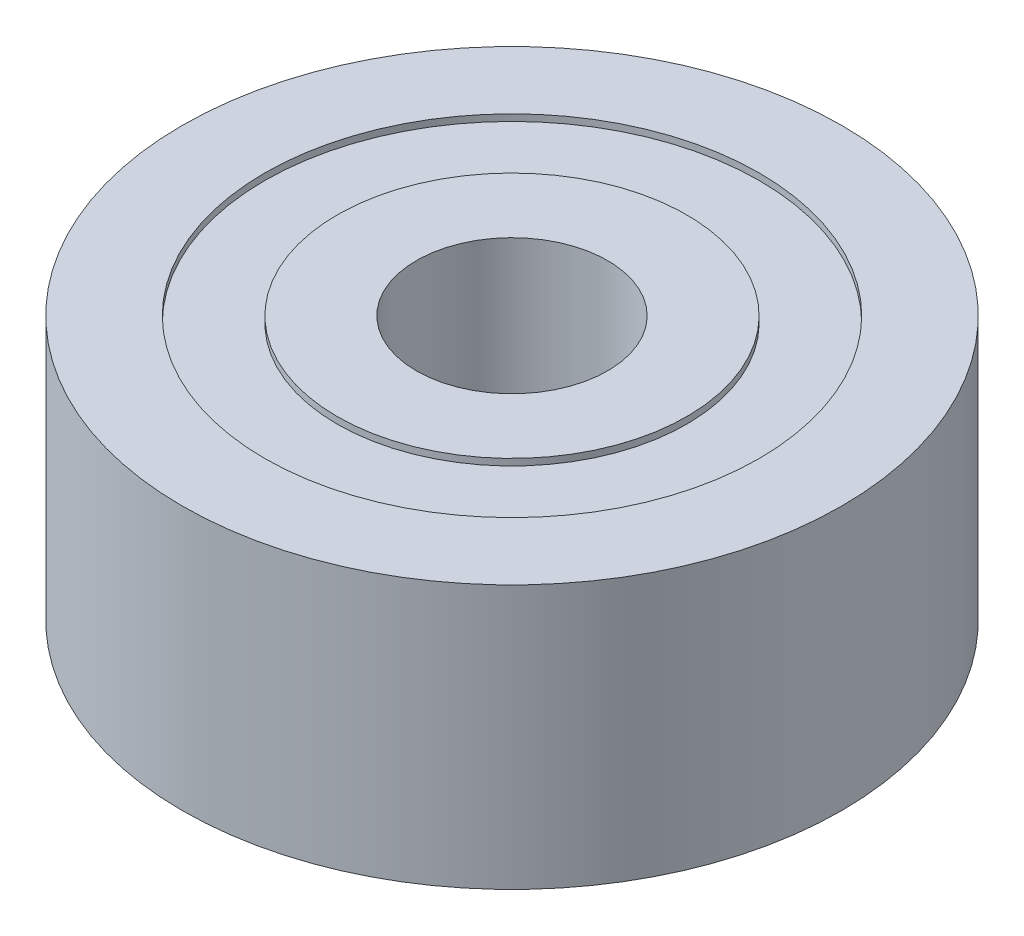
ISO-10303-21;
HEADER;
FILE_DESCRIPTION(('STEP AP214'),'2;1');
FILE_NAME('part.step','',(''),(''),'','','');
FILE_SCHEMA(('AUTOMOTIVE_DESIGN { 1 0 10303 214 1 1 1 1 }'));
ENDSEC;
DATA;
#1=APPLICATION_CONTEXT('core data for automotive mechanical design processes');
#2=APPLICATION_PROTOCOL_DEFINITION('international standard','automotive_design',2000,#1);
#3=PRODUCT_CONTEXT('',#1,'mechanical');
#4=PRODUCT('Part','Part','',(#3));
#5=PRODUCT_RELATED_PRODUCT_CATEGORY('part','',(#4));
#6=PRODUCT_DEFINITION_FORMATION('','',#4);
#7=PRODUCT_DEFINITION_CONTEXT('part definition',#1,'design');
#8=PRODUCT_DEFINITION('design','',#6,#7);
#9=PRODUCT_DEFINITION_SHAPE('','',#8);
#10=(LENGTH_UNIT() NAMED_UNIT(*) SI_UNIT(.MILLI.,.METRE.));
#11=(NAMED_UNIT(*) PLANE_ANGLE_UNIT() SI_UNIT($,.RADIAN.));
#12=(NAMED_UNIT(*) SI_UNIT($,.STERADIAN.) SOLID_ANGLE_UNIT());
#13=UNCERTAINTY_MEASURE_WITH_UNIT(LENGTH_MEASURE(1.E-05),#10,'distance_accuracy_value','');
#14=(GEOMETRIC_REPRESENTATION_CONTEXT(3) GLOBAL_UNCERTAINTY_ASSIGNED_CONTEXT((#13)) GLOBAL_UNIT_ASSIGNED_CONTEXT((#10,
#11,#12)) REPRESENTATION_CONTEXT('',''));
#15=CARTESIAN_POINT('',(0.,0.,0.));
#16=DIRECTION('',(0.,0.,1.));
#17=DIRECTION('',(1.,0.,0.));
#18=AXIS2_PLACEMENT_3D('',#15,#16,#17);
#19=CARTESIAN_POINT('',(0.,-2.,0.));
#20=DIRECTION('',(0.,1.,0.));
#21=DIRECTION('',(0.,0.,1.));
#22=AXIS2_PLACEMENT_3D('',#19,#20,#21);
#23=PLANE('',#22);
#24=CARTESIAN_POINT('',(0.,-2.,0.));
#25=DIRECTION('',(0.,1.,0.));
#26=DIRECTION('',(0.,0.,1.));
#27=AXIS2_PLACEMENT_3D('',#24,#25,#26);
#28=CIRCLE('',#27,1.45);
#29=CARTESIAN_POINT('',(0.,-2.,1.45));
#30=VERTEX_POINT('',#29);
#31=EDGE_CURVE('E52',#30,#30,#28,.T.);
#32=ORIENTED_EDGE('',*,*,#31,.T.);
#33=EDGE_LOOP('',(#32));
#34=FACE_BOUND('',#33,.T.);
#35=CARTESIAN_POINT('',(0.,-2.,0.));
#36=DIRECTION('',(0.,1.,0.));
#37=DIRECTION('',(0.,0.,1.));
#38=AXIS2_PLACEMENT_3D('',#35,#36,#37);
#39=CIRCLE('',#38,2.65);
#40=CARTESIAN_POINT('',(0.,-2.,2.65));
#41=VERTEX_POINT('',#40);
#42=EDGE_CURVE('E84',#41,#41,#39,.T.);
#43=ORIENTED_EDGE('',*,*,#42,.F.);
#44=EDGE_LOOP('',(#43));
#45=FACE_BOUND('',#44,.T.);
#46=ADVANCED_FACE('F37',(#34,#45),#23,.F.);
#47=CARTESIAN_POINT('',(0.,2.,0.));
#48=DIRECTION('',(0.,1.,0.));
#49=DIRECTION('',(0.,0.,1.));
#50=AXIS2_PLACEMENT_3D('',#47,#48,#49);
#51=PLANE('',#50);
#52=CARTESIAN_POINT('',(0.,2.,0.));
#53=DIRECTION('',(0.,1.,0.));
#54=DIRECTION('',(0.,0.,1.));
#55=AXIS2_PLACEMENT_3D('',#52,#53,#54);
#56=CIRCLE('',#55,1.45);
#57=CARTESIAN_POINT('',(0.,2.,1.45));
#58=VERTEX_POINT('',#57);
#59=EDGE_CURVE('E50',#58,#58,#56,.T.);
#60=ORIENTED_EDGE('',*,*,#59,.F.);
#61=EDGE_LOOP('',(#60));
#62=FACE_BOUND('',#61,.T.);
#63=CARTESIAN_POINT('',(0.,2.,0.));
#64=DIRECTION('',(0.,1.,0.));
#65=DIRECTION('',(0.,0.,1.));
#66=AXIS2_PLACEMENT_3D('',#63,#64,#65);
#67=CIRCLE('',#66,2.65);
#68=CARTESIAN_POINT('',(0.,2.,2.65));
#69=VERTEX_POINT('',#68);
#70=EDGE_CURVE('E68',#69,#69,#67,.T.);
#71=ORIENTED_EDGE('',*,*,#70,.T.);
#72=EDGE_LOOP('',(#71));
#73=FACE_BOUND('',#72,.T.);
#74=ADVANCED_FACE('F102',(#62,#73),#51,.T.);
#75=CARTESIAN_POINT('',(0.,2.,0.));
#76=DIRECTION('',(0.,1.,0.));
#77=DIRECTION('',(0.,0.,1.));
#78=AXIS2_PLACEMENT_3D('',#75,#76,#77);
#79=CIRCLE('',#78,3.75);
#80=CARTESIAN_POINT('',(0.,2.,3.75));
#81=VERTEX_POINT('',#80);
#82=EDGE_CURVE('E60',#81,#81,#79,.T.);
#83=ORIENTED_EDGE('',*,*,#82,.F.);
#84=EDGE_LOOP('',(#83));
#85=FACE_BOUND('',#84,.T.);
#86=CARTESIAN_POINT('',(0.,2.,0.));
#87=DIRECTION('',(0.,1.,0.));
#88=DIRECTION('',(0.,0.,1.));
#89=AXIS2_PLACEMENT_3D('',#86,#87,#88);
#90=CIRCLE('',#89,5.);
#91=CARTESIAN_POINT('',(0.,2.,5.));
#92=VERTEX_POINT('',#91);
#93=EDGE_CURVE('E10',#92,#92,#90,.T.);
#94=ORIENTED_EDGE('',*,*,#93,.T.);
#95=EDGE_LOOP('',(#94));
#96=FACE_BOUND('',#95,.T.);
#97=ADVANCED_FACE('F108',(#85,#96),#51,.T.);
#98=CARTESIAN_POINT('',(0.,-2.,0.));
#99=DIRECTION('',(0.,1.,0.));
#100=DIRECTION('',(0.,0.,1.));
#101=AXIS2_PLACEMENT_3D('',#98,#99,#100);
#102=CIRCLE('',#101,3.75);
#103=CARTESIAN_POINT('',(0.,-2.,3.75));
#104=VERTEX_POINT('',#103);
#105=EDGE_CURVE('E76',#104,#104,#102,.T.);
#106=ORIENTED_EDGE('',*,*,#105,.T.);
#107=EDGE_LOOP('',(#106));
#108=FACE_BOUND('',#107,.T.);
#109=CARTESIAN_POINT('',(0.,-2.,0.));
#110=DIRECTION('',(0.,1.,0.));
#111=DIRECTION('',(0.,0.,1.));
#112=AXIS2_PLACEMENT_3D('',#109,#110,#111);
#113=CIRCLE('',#112,5.);
#114=CARTESIAN_POINT('',(0.,-2.,5.));
#115=VERTEX_POINT('',#114);
#116=EDGE_CURVE('E41',#115,#115,#113,.T.);
#117=ORIENTED_EDGE('',*,*,#116,.F.);
#118=EDGE_LOOP('',(#117));
#119=FACE_BOUND('',#118,.T.);
#120=ADVANCED_FACE('F104',(#108,#119),#23,.F.);
#121=CARTESIAN_POINT('',(0.,2.,0.));
#122=DIRECTION('',(0.,-1.,0.));
#123=DIRECTION('',(0.,0.,-1.));
#124=AXIS2_PLACEMENT_3D('',#121,#122,#123);
#125=CYLINDRICAL_SURFACE('',#124,5.);
#126=ORIENTED_EDGE('',*,*,#93,.F.);
#127=EDGE_LOOP('',(#126));
#128=FACE_BOUND('',#127,.T.);
#129=ORIENTED_EDGE('',*,*,#116,.T.);
#130=EDGE_LOOP('',(#129));
#131=FACE_BOUND('',#130,.T.);
#132=ADVANCED_FACE('F39',(#128,#131),#125,.T.);
#133=CARTESIAN_POINT('',(0.,2.,0.));
#134=DIRECTION('',(0.,-1.,0.));
#135=DIRECTION('',(0.,0.,-1.));
#136=AXIS2_PLACEMENT_3D('',#133,#134,#135);
#137=CYLINDRICAL_SURFACE('',#136,1.45);
#138=ORIENTED_EDGE('',*,*,#59,.T.);
#139=EDGE_LOOP('',(#138));
#140=FACE_BOUND('',#139,.T.);
#141=ORIENTED_EDGE('',*,*,#31,.F.);
#142=EDGE_LOOP('',(#141));
#143=FACE_BOUND('',#142,.T.);
#144=ADVANCED_FACE('F117',(#140,#143),#137,.F.);
#145=CARTESIAN_POINT('',(0.,1.9,0.));
#146=DIRECTION('',(0.,1.,0.));
#147=DIRECTION('',(0.,0.,1.));
#148=AXIS2_PLACEMENT_3D('',#145,#146,#147);
#149=CYLINDRICAL_SURFACE('',#148,3.75);
#150=CARTESIAN_POINT('',(0.,1.9,0.));
#151=DIRECTION('',(0.,1.,0.));
#152=DIRECTION('',(0.,0.,1.));
#153=AXIS2_PLACEMENT_3D('',#150,#151,#152);
#154=CIRCLE('',#153,3.75);
#155=CARTESIAN_POINT('',(0.,1.9,3.75));
#156=VERTEX_POINT('',#155);
#157=EDGE_CURVE('E56',#156,#156,#154,.T.);
#158=ORIENTED_EDGE('',*,*,#157,.F.);
#159=EDGE_LOOP('',(#158));
#160=FACE_BOUND('',#159,.T.);
#161=ORIENTED_EDGE('',*,*,#82,.T.);
#162=EDGE_LOOP('',(#161));
#163=FACE_BOUND('',#162,.T.);
#164=ADVANCED_FACE('F141',(#160,#163),#149,.F.);
#165=CARTESIAN_POINT('',(0.,1.9,0.));
#166=DIRECTION('',(0.,1.,0.));
#167=DIRECTION('',(0.,0.,1.));
#168=AXIS2_PLACEMENT_3D('',#165,#166,#167);
#169=PLANE('',#168);
#170=CARTESIAN_POINT('',(0.,1.9,0.));
#171=DIRECTION('',(0.,1.,0.));
#172=DIRECTION('',(0.,0.,1.));
#173=AXIS2_PLACEMENT_3D('',#170,#171,#172);
#174=CIRCLE('',#173,2.65);
#175=CARTESIAN_POINT('',(0.,1.9,2.65));
#176=VERTEX_POINT('',#175);
#177=EDGE_CURVE('E64',#176,#176,#174,.T.);
#178=ORIENTED_EDGE('',*,*,#177,.F.);
#179=EDGE_LOOP('',(#178));
#180=FACE_BOUND('',#179,.T.);
#181=ORIENTED_EDGE('',*,*,#157,.T.);
#182=EDGE_LOOP('',(#181));
#183=FACE_BOUND('',#182,.T.);
#184=ADVANCED_FACE('F137',(#180,#183),#169,.T.);
#185=CARTESIAN_POINT('',(0.,1.9,0.));
#186=DIRECTION('',(0.,1.,0.));
#187=DIRECTION('',(0.,0.,1.));
#188=AXIS2_PLACEMENT_3D('',#185,#186,#187);
#189=CYLINDRICAL_SURFACE('',#188,2.65);
#190=ORIENTED_EDGE('',*,*,#177,.T.);
#191=EDGE_LOOP('',(#190));
#192=FACE_BOUND('',#191,.T.);
#193=ORIENTED_EDGE('',*,*,#70,.F.);
#194=EDGE_LOOP('',(#193));
#195=FACE_BOUND('',#194,.T.);
#196=ADVANCED_FACE('F131',(#192,#195),#189,.T.);
#197=CARTESIAN_POINT('',(0.,-1.9,0.));
#198=DIRECTION('',(0.,-1.,0.));
#199=DIRECTION('',(0.,0.,1.));
#200=AXIS2_PLACEMENT_3D('',#197,#198,#199);
#201=PLANE('',#200);
#202=CARTESIAN_POINT('',(0.,-1.9,0.));
#203=DIRECTION('',(0.,1.,0.));
#204=DIRECTION('',(0.,0.,1.));
#205=AXIS2_PLACEMENT_3D('',#202,#203,#204);
#206=CIRCLE('',#205,3.75);
#207=CARTESIAN_POINT('',(0.,-1.9,3.75));
#208=VERTEX_POINT('',#207);
#209=EDGE_CURVE('E72',#208,#208,#206,.T.);
#210=ORIENTED_EDGE('',*,*,#209,.F.);
#211=EDGE_LOOP('',(#210));
#212=FACE_BOUND('',#211,.T.);
#213=CARTESIAN_POINT('',(0.,-1.9,0.));
#214=DIRECTION('',(0.,1.,0.));
#215=DIRECTION('',(0.,0.,1.));
#216=AXIS2_PLACEMENT_3D('',#213,#214,#215);
#217=CIRCLE('',#216,2.65);
#218=CARTESIAN_POINT('',(0.,-1.9,2.65));
#219=VERTEX_POINT('',#218);
#220=EDGE_CURVE('E80',#219,#219,#217,.T.);
#221=ORIENTED_EDGE('',*,*,#220,.T.);
#222=EDGE_LOOP('',(#221));
#223=FACE_BOUND('',#222,.T.);
#224=ADVANCED_FACE('F92',(#212,#223),#201,.T.);
#225=CARTESIAN_POINT('',(0.,-1.9,0.));
#226=DIRECTION('',(0.,-1.,0.));
#227=DIRECTION('',(0.,0.,-1.));
#228=AXIS2_PLACEMENT_3D('',#225,#226,#227);
#229=CYLINDRICAL_SURFACE('',#228,3.75);
#230=ORIENTED_EDGE('',*,*,#209,.T.);
#231=EDGE_LOOP('',(#230));
#232=FACE_BOUND('',#231,.T.);
#233=ORIENTED_EDGE('',*,*,#105,.F.);
#234=EDGE_LOOP('',(#233));
#235=FACE_BOUND('',#234,.T.);
#236=ADVANCED_FACE('F97',(#232,#235),#229,.F.);
#237=CARTESIAN_POINT('',(0.,-1.9,0.));
#238=DIRECTION('',(0.,-1.,0.));
#239=DIRECTION('',(0.,0.,-1.));
#240=AXIS2_PLACEMENT_3D('',#237,#238,#239);
#241=CYLINDRICAL_SURFACE('',#240,2.65);
#242=ORIENTED_EDGE('',*,*,#220,.F.);
#243=EDGE_LOOP('',(#242));
#244=FACE_BOUND('',#243,.T.);
#245=ORIENTED_EDGE('',*,*,#42,.T.);
#246=EDGE_LOOP('',(#245));
#247=FACE_BOUND('',#246,.T.);
#248=ADVANCED_FACE('F94',(#244,#247),#241,.T.);
#249=CLOSED_SHELL('',(#46,#74,#97,#120,#132,#144,#164,#184,#196,#224,#236,#248));
#250=MANIFOLD_SOLID_BREP('B2',#249);
#251=ADVANCED_BREP_SHAPE_REPRESENTATION('',(#18,#250),#14);
#252=SHAPE_DEFINITION_REPRESENTATION(#9,#251);
ENDSEC;
END-ISO-10303-21;
